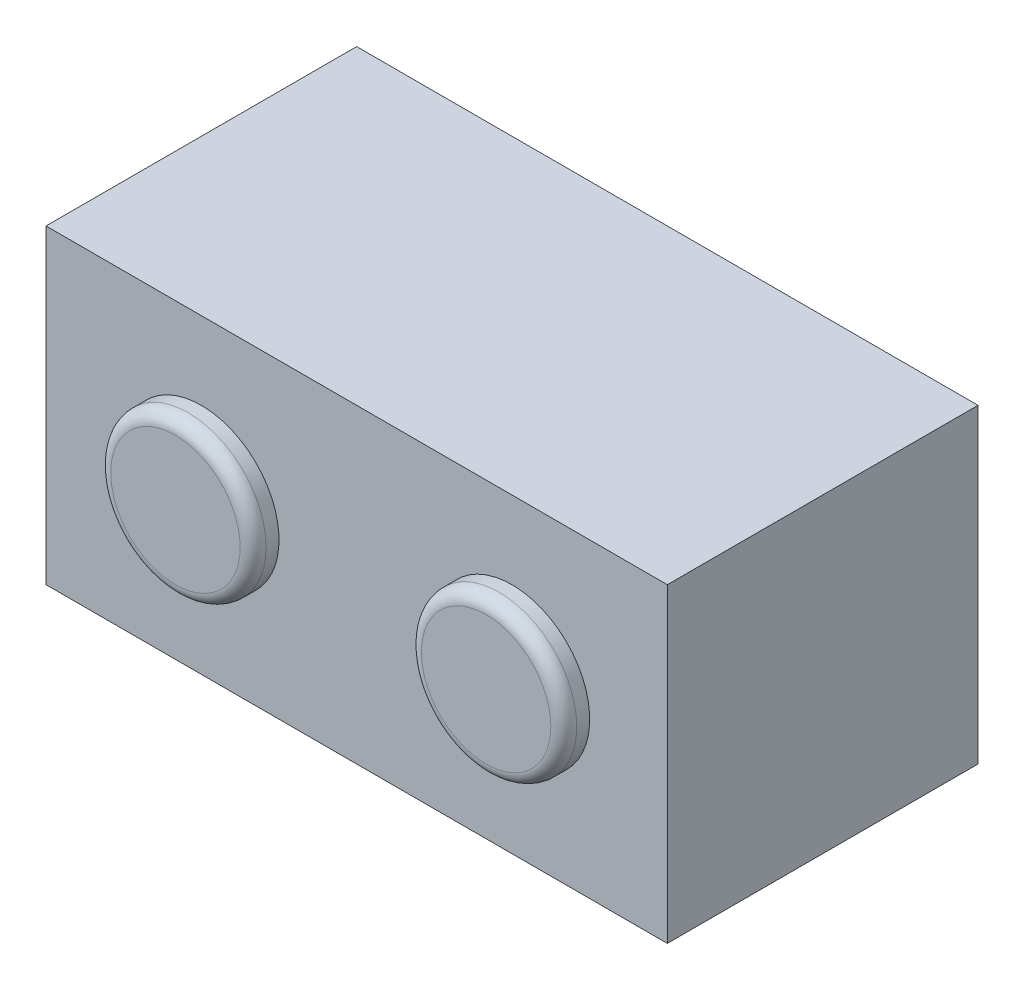
ISO-10303-21;
HEADER;
FILE_DESCRIPTION(('STEP AP214'),'2;1');
FILE_NAME('part.step','',(''),(''),'','','');
FILE_SCHEMA(('AUTOMOTIVE_DESIGN { 1 0 10303 214 1 1 1 1 }'));
ENDSEC;
DATA;
#1=APPLICATION_CONTEXT('core data for automotive mechanical design processes');
#2=APPLICATION_PROTOCOL_DEFINITION('international standard','automotive_design',2000,#1);
#3=PRODUCT_CONTEXT('',#1,'mechanical');
#4=PRODUCT('Part','Part','',(#3));
#5=PRODUCT_RELATED_PRODUCT_CATEGORY('part','',(#4));
#6=PRODUCT_DEFINITION_FORMATION('','',#4);
#7=PRODUCT_DEFINITION_CONTEXT('part definition',#1,'design');
#8=PRODUCT_DEFINITION('design','',#6,#7);
#9=PRODUCT_DEFINITION_SHAPE('','',#8);
#10=(LENGTH_UNIT() NAMED_UNIT(*) SI_UNIT(.MILLI.,.METRE.));
#11=(NAMED_UNIT(*) PLANE_ANGLE_UNIT() SI_UNIT($,.RADIAN.));
#12=(NAMED_UNIT(*) SI_UNIT($,.STERADIAN.) SOLID_ANGLE_UNIT());
#13=UNCERTAINTY_MEASURE_WITH_UNIT(LENGTH_MEASURE(1.E-05),#10,'distance_accuracy_value','');
#14=(GEOMETRIC_REPRESENTATION_CONTEXT(3) GLOBAL_UNCERTAINTY_ASSIGNED_CONTEXT((#13)) GLOBAL_UNIT_ASSIGNED_CONTEXT((#10,
#11,#12)) REPRESENTATION_CONTEXT('',''));
#15=CARTESIAN_POINT('',(0.,0.,0.));
#16=DIRECTION('',(0.,0.,1.));
#17=DIRECTION('',(1.,0.,0.));
#18=AXIS2_PLACEMENT_3D('',#15,#16,#17);
#19=CARTESIAN_POINT('',(609.6,609.6,-304.8));
#20=DIRECTION('',(-1.,0.,0.));
#21=DIRECTION('',(0.,0.,1.));
#22=AXIS2_PLACEMENT_3D('',#19,#20,#21);
#23=PLANE('',#22);
#24=DIRECTION('',(0.,0.,-1.));
#25=VECTOR('',#24,1.);
#26=CARTESIAN_POINT('',(609.6,0.,-304.8));
#27=LINE('',#26,#25);
#28=CARTESIAN_POINT('',(609.6,0.,304.8));
#29=VERTEX_POINT('',#28);
#30=CARTESIAN_POINT('',(609.6,0.,-304.8));
#31=VERTEX_POINT('',#30);
#32=EDGE_CURVE('E102',#29,#31,#27,.T.);
#33=ORIENTED_EDGE('',*,*,#32,.T.);
#34=DIRECTION('',(0.,-1.,0.));
#35=VECTOR('',#34,1.);
#36=CARTESIAN_POINT('',(609.6,609.6,-304.8));
#37=LINE('',#36,#35);
#38=CARTESIAN_POINT('',(609.6,609.6,-304.8));
#39=VERTEX_POINT('',#38);
#40=EDGE_CURVE('E93',#39,#31,#37,.T.);
#41=ORIENTED_EDGE('',*,*,#40,.F.);
#42=DIRECTION('',(0.,0.,-1.));
#43=VECTOR('',#42,1.);
#44=CARTESIAN_POINT('',(609.6,609.6,-304.8));
#45=LINE('',#44,#43);
#46=CARTESIAN_POINT('',(609.6,609.6,304.8));
#47=VERTEX_POINT('',#46);
#48=EDGE_CURVE('E87',#47,#39,#45,.T.);
#49=ORIENTED_EDGE('',*,*,#48,.F.);
#50=DIRECTION('',(0.,-1.,0.));
#51=VECTOR('',#50,1.);
#52=CARTESIAN_POINT('',(609.6,609.6,304.8));
#53=LINE('',#52,#51);
#54=EDGE_CURVE('E98',#47,#29,#53,.T.);
#55=ORIENTED_EDGE('',*,*,#54,.T.);
#56=EDGE_LOOP('',(#33,#41,#49,#55));
#57=FACE_BOUND('',#56,.T.);
#58=ADVANCED_FACE('F34',(#57),#23,.F.);
#59=CARTESIAN_POINT('',(-609.6,609.6,-304.8));
#60=DIRECTION('',(0.,0.,1.));
#61=DIRECTION('',(1.,0.,0.));
#62=AXIS2_PLACEMENT_3D('',#59,#60,#61);
#63=PLANE('',#62);
#64=DIRECTION('',(-1.,0.,0.));
#65=VECTOR('',#64,1.);
#66=CARTESIAN_POINT('',(-609.6,0.,-304.8));
#67=LINE('',#66,#65);
#68=CARTESIAN_POINT('',(-609.6,0.,-304.8));
#69=VERTEX_POINT('',#68);
#70=EDGE_CURVE('E92',#31,#69,#67,.T.);
#71=ORIENTED_EDGE('',*,*,#70,.T.);
#72=DIRECTION('',(0.,-1.,0.));
#73=VECTOR('',#72,1.);
#74=CARTESIAN_POINT('',(-609.6,609.6,-304.8));
#75=LINE('',#74,#73);
#76=CARTESIAN_POINT('',(-609.6,609.6,-304.8));
#77=VERTEX_POINT('',#76);
#78=EDGE_CURVE('E90',#77,#69,#75,.T.);
#79=ORIENTED_EDGE('',*,*,#78,.F.);
#80=DIRECTION('',(-1.,0.,0.));
#81=VECTOR('',#80,1.);
#82=CARTESIAN_POINT('',(-609.6,609.6,-304.8));
#83=LINE('',#82,#81);
#84=EDGE_CURVE('E82',#39,#77,#83,.T.);
#85=ORIENTED_EDGE('',*,*,#84,.F.);
#86=ORIENTED_EDGE('',*,*,#40,.T.);
#87=EDGE_LOOP('',(#71,#79,#85,#86));
#88=FACE_BOUND('',#87,.T.);
#89=ADVANCED_FACE('F91',(#88),#63,.F.);
#90=CARTESIAN_POINT('',(-609.6,609.6,-304.8));
#91=DIRECTION('',(1.,0.,0.));
#92=DIRECTION('',(0.,0.,-1.));
#93=AXIS2_PLACEMENT_3D('',#90,#91,#92);
#94=PLANE('',#93);
#95=DIRECTION('',(0.,0.,1.));
#96=VECTOR('',#95,1.);
#97=CARTESIAN_POINT('',(-609.6,0.,-304.8));
#98=LINE('',#97,#96);
#99=CARTESIAN_POINT('',(-609.6,0.,304.8));
#100=VERTEX_POINT('',#99);
#101=EDGE_CURVE('E68',#69,#100,#98,.T.);
#102=ORIENTED_EDGE('',*,*,#101,.T.);
#103=DIRECTION('',(0.,-1.,0.));
#104=VECTOR('',#103,1.);
#105=CARTESIAN_POINT('',(-609.6,609.6,304.8));
#106=LINE('',#105,#104);
#107=CARTESIAN_POINT('',(-609.6,609.6,304.8));
#108=VERTEX_POINT('',#107);
#109=EDGE_CURVE('E94',#108,#100,#106,.T.);
#110=ORIENTED_EDGE('',*,*,#109,.F.);
#111=DIRECTION('',(0.,0.,1.));
#112=VECTOR('',#111,1.);
#113=CARTESIAN_POINT('',(-609.6,609.6,-304.8));
#114=LINE('',#113,#112);
#115=EDGE_CURVE('E85',#77,#108,#114,.T.);
#116=ORIENTED_EDGE('',*,*,#115,.F.);
#117=ORIENTED_EDGE('',*,*,#78,.T.);
#118=EDGE_LOOP('',(#102,#110,#116,#117));
#119=FACE_BOUND('',#118,.T.);
#120=ADVANCED_FACE('F96',(#119),#94,.F.);
#121=CARTESIAN_POINT('',(-609.6,609.6,304.8));
#122=DIRECTION('',(0.,0.,-1.));
#123=DIRECTION('',(-1.,0.,0.));
#124=AXIS2_PLACEMENT_3D('',#121,#122,#123);
#125=PLANE('',#124);
#126=CARTESIAN_POINT('',(304.8,304.8,304.8));
#127=DIRECTION('',(0.,0.,-1.));
#128=DIRECTION('',(-1.,0.,0.));
#129=AXIS2_PLACEMENT_3D('',#126,#127,#128);
#130=CIRCLE('',#129,152.4);
#131=CARTESIAN_POINT('',(152.4,304.8,304.8));
#132=VERTEX_POINT('',#131);
#133=EDGE_CURVE('E114',#132,#132,#130,.F.);
#134=ORIENTED_EDGE('',*,*,#133,.F.);
#135=EDGE_LOOP('',(#134));
#136=FACE_BOUND('',#135,.T.);
#137=CARTESIAN_POINT('',(-304.8,304.8,304.8));
#138=DIRECTION('',(0.,0.,-1.));
#139=DIRECTION('',(-1.,0.,0.));
#140=AXIS2_PLACEMENT_3D('',#137,#138,#139);
#141=CIRCLE('',#140,152.4);
#142=CARTESIAN_POINT('',(-457.2,304.8,304.8));
#143=VERTEX_POINT('',#142);
#144=EDGE_CURVE('E111',#143,#143,#141,.F.);
#145=ORIENTED_EDGE('',*,*,#144,.F.);
#146=EDGE_LOOP('',(#145));
#147=FACE_BOUND('',#146,.T.);
#148=DIRECTION('',(1.,0.,0.));
#149=VECTOR('',#148,1.);
#150=CARTESIAN_POINT('',(-609.6,0.,304.8));
#151=LINE('',#150,#149);
#152=EDGE_CURVE('E74',#100,#29,#151,.T.);
#153=ORIENTED_EDGE('',*,*,#152,.T.);
#154=ORIENTED_EDGE('',*,*,#54,.F.);
#155=DIRECTION('',(1.,0.,0.));
#156=VECTOR('',#155,1.);
#157=CARTESIAN_POINT('',(-609.6,609.6,304.8));
#158=LINE('',#157,#156);
#159=EDGE_CURVE('E51',#108,#47,#158,.T.);
#160=ORIENTED_EDGE('',*,*,#159,.F.);
#161=ORIENTED_EDGE('',*,*,#109,.T.);
#162=EDGE_LOOP('',(#153,#154,#160,#161));
#163=FACE_BOUND('',#162,.T.);
#164=ADVANCED_FACE('F146',(#136,#147,#163),#125,.F.);
#165=CARTESIAN_POINT('',(0.,609.6,0.));
#166=DIRECTION('',(0.,1.,0.));
#167=DIRECTION('',(0.,0.,1.));
#168=AXIS2_PLACEMENT_3D('',#165,#166,#167);
#169=PLANE('',#168);
#170=ORIENTED_EDGE('',*,*,#48,.T.);
#171=ORIENTED_EDGE('',*,*,#84,.T.);
#172=ORIENTED_EDGE('',*,*,#115,.T.);
#173=ORIENTED_EDGE('',*,*,#159,.T.);
#174=EDGE_LOOP('',(#170,#171,#172,#173));
#175=FACE_BOUND('',#174,.T.);
#176=ADVANCED_FACE('F83',(#175),#169,.T.);
#177=CARTESIAN_POINT('',(0.,0.,0.));
#178=DIRECTION('',(0.,1.,0.));
#179=DIRECTION('',(0.,0.,1.));
#180=AXIS2_PLACEMENT_3D('',#177,#178,#179);
#181=PLANE('',#180);
#182=ORIENTED_EDGE('',*,*,#32,.F.);
#183=ORIENTED_EDGE('',*,*,#152,.F.);
#184=ORIENTED_EDGE('',*,*,#101,.F.);
#185=ORIENTED_EDGE('',*,*,#70,.F.);
#186=EDGE_LOOP('',(#182,#183,#184,#185));
#187=FACE_BOUND('',#186,.T.);
#188=ADVANCED_FACE('F150',(#187),#181,.F.);
#189=CARTESIAN_POINT('',(-304.8,304.8,355.6));
#190=DIRECTION('',(0.,0.,-1.));
#191=DIRECTION('',(-1.,0.,0.));
#192=AXIS2_PLACEMENT_3D('',#189,#190,#191);
#193=CYLINDRICAL_SURFACE('',#192,152.4);
#194=CARTESIAN_POINT('',(-304.8,304.8,330.2));
#195=DIRECTION('',(0.,0.,1.));
#196=DIRECTION('',(1.,0.,0.));
#197=AXIS2_PLACEMENT_3D('',#194,#195,#196);
#198=CIRCLE('',#197,152.4);
#199=CARTESIAN_POINT('',(-152.4,304.8,330.2));
#200=VERTEX_POINT('',#199);
#201=EDGE_CURVE('E11',#200,#200,#198,.F.);
#202=ORIENTED_EDGE('',*,*,#201,.T.);
#203=EDGE_LOOP('',(#202));
#204=FACE_BOUND('',#203,.T.);
#205=ORIENTED_EDGE('',*,*,#144,.T.);
#206=EDGE_LOOP('',(#205));
#207=FACE_BOUND('',#206,.T.);
#208=ADVANCED_FACE('F153',(#204,#207),#193,.T.);
#209=CARTESIAN_POINT('',(-304.8,304.8,355.6));
#210=DIRECTION('',(0.,0.,1.));
#211=DIRECTION('',(1.,0.,0.));
#212=AXIS2_PLACEMENT_3D('',#209,#210,#211);
#213=PLANE('',#212);
#214=CARTESIAN_POINT('',(-304.8,304.8,355.6));
#215=DIRECTION('',(0.,0.,1.));
#216=DIRECTION('',(1.,0.,0.));
#217=AXIS2_PLACEMENT_3D('',#214,#215,#216);
#218=CIRCLE('',#217,127.);
#219=CARTESIAN_POINT('',(-177.8,304.8,355.6));
#220=VERTEX_POINT('',#219);
#221=EDGE_CURVE('E43',#220,#220,#218,.T.);
#222=ORIENTED_EDGE('',*,*,#221,.T.);
#223=EDGE_LOOP('',(#222));
#224=FACE_BOUND('',#223,.T.);
#225=ADVANCED_FACE('F125',(#224),#213,.T.);
#226=CARTESIAN_POINT('',(304.8,304.8,355.6));
#227=DIRECTION('',(0.,0.,-1.));
#228=DIRECTION('',(-1.,0.,0.));
#229=AXIS2_PLACEMENT_3D('',#226,#227,#228);
#230=CYLINDRICAL_SURFACE('',#229,152.4);
#231=CARTESIAN_POINT('',(304.8,304.8,330.2));
#232=DIRECTION('',(0.,0.,1.));
#233=DIRECTION('',(1.,0.,0.));
#234=AXIS2_PLACEMENT_3D('',#231,#232,#233);
#235=CIRCLE('',#234,152.4);
#236=CARTESIAN_POINT('',(457.2,304.8,330.2));
#237=VERTEX_POINT('',#236);
#238=EDGE_CURVE('E120',#237,#237,#235,.F.);
#239=ORIENTED_EDGE('',*,*,#238,.T.);
#240=EDGE_LOOP('',(#239));
#241=FACE_BOUND('',#240,.T.);
#242=ORIENTED_EDGE('',*,*,#133,.T.);
#243=EDGE_LOOP('',(#242));
#244=FACE_BOUND('',#243,.T.);
#245=ADVANCED_FACE('F162',(#241,#244),#230,.T.);
#246=CARTESIAN_POINT('',(304.8,304.8,355.6));
#247=DIRECTION('',(0.,0.,1.));
#248=DIRECTION('',(1.,0.,0.));
#249=AXIS2_PLACEMENT_3D('',#246,#247,#248);
#250=PLANE('',#249);
#251=CARTESIAN_POINT('',(304.8,304.8,355.6));
#252=DIRECTION('',(0.,0.,1.));
#253=DIRECTION('',(1.,0.,0.));
#254=AXIS2_PLACEMENT_3D('',#251,#252,#253);
#255=CIRCLE('',#254,127.);
#256=CARTESIAN_POINT('',(431.8,304.8,355.6));
#257=VERTEX_POINT('',#256);
#258=EDGE_CURVE('E117',#257,#257,#255,.T.);
#259=ORIENTED_EDGE('',*,*,#258,.T.);
#260=EDGE_LOOP('',(#259));
#261=FACE_BOUND('',#260,.T.);
#262=ADVANCED_FACE('F133',(#261),#250,.T.);
#263=CARTESIAN_POINT('',(304.8,304.8,330.2));
#264=DIRECTION('',(0.,0.,1.));
#265=DIRECTION('',(1.,0.,0.));
#266=AXIS2_PLACEMENT_3D('',#263,#264,#265);
#267=TOROIDAL_SURFACE('',#266,127.,25.4);
#268=ORIENTED_EDGE('',*,*,#238,.F.);
#269=EDGE_LOOP('',(#268));
#270=FACE_BOUND('',#269,.T.);
#271=ORIENTED_EDGE('',*,*,#258,.F.);
#272=EDGE_LOOP('',(#271));
#273=FACE_BOUND('',#272,.T.);
#274=ADVANCED_FACE('F128',(#270,#273),#267,.T.);
#275=CARTESIAN_POINT('',(-304.8,304.8,330.2));
#276=DIRECTION('',(0.,0.,1.));
#277=DIRECTION('',(1.,0.,0.));
#278=AXIS2_PLACEMENT_3D('',#275,#276,#277);
#279=TOROIDAL_SURFACE('',#278,127.,25.4);
#280=ORIENTED_EDGE('',*,*,#201,.F.);
#281=EDGE_LOOP('',(#280));
#282=FACE_BOUND('',#281,.T.);
#283=ORIENTED_EDGE('',*,*,#221,.F.);
#284=EDGE_LOOP('',(#283));
#285=FACE_BOUND('',#284,.T.);
#286=ADVANCED_FACE('F36',(#282,#285),#279,.T.);
#287=CLOSED_SHELL('',(#58,#89,#120,#164,#176,#188,#208,#225,#245,#262,#274,#286));
#288=MANIFOLD_SOLID_BREP('B2',#287);
#289=ADVANCED_BREP_SHAPE_REPRESENTATION('',(#18,#288),#14);
#290=SHAPE_DEFINITION_REPRESENTATION(#9,#289);
ENDSEC;
END-ISO-10303-21;
